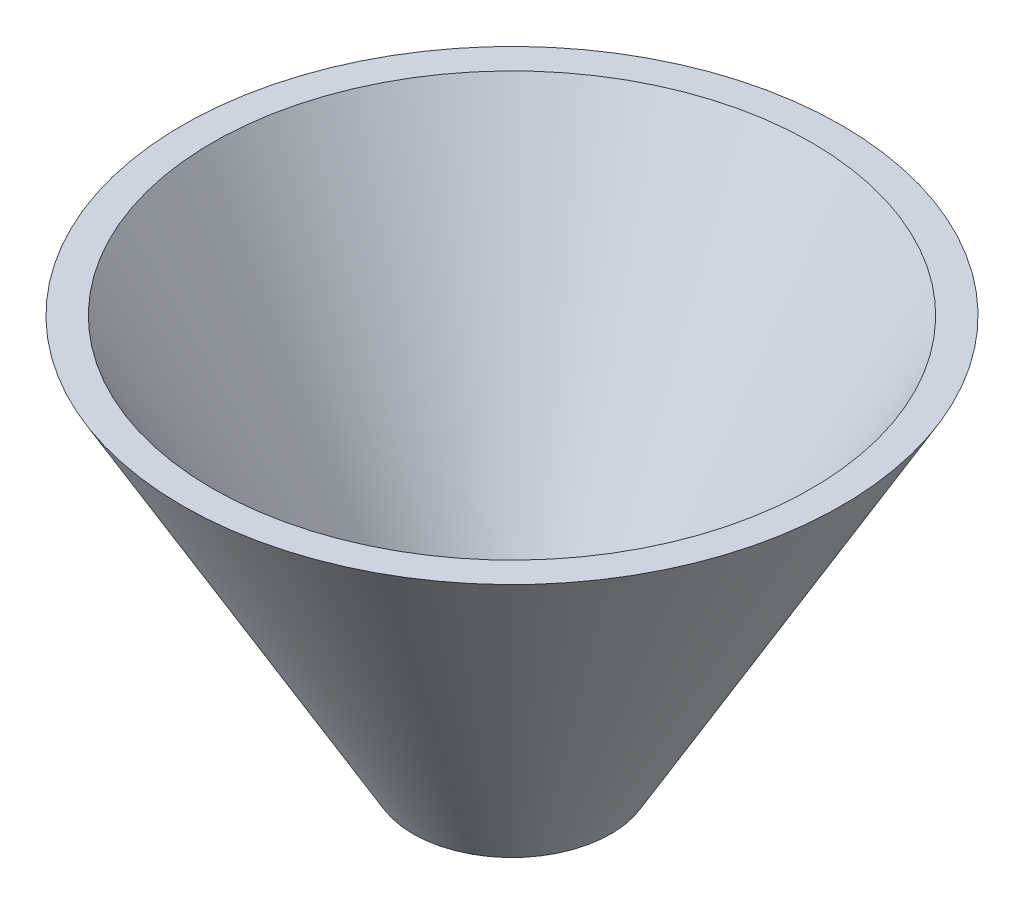
ISO-10303-21;
HEADER;
FILE_DESCRIPTION(('STEP AP214'),'2;1');
FILE_NAME('part.step','',(''),(''),'','','');
FILE_SCHEMA(('AUTOMOTIVE_DESIGN { 1 0 10303 214 1 1 1 1 }'));
ENDSEC;
DATA;
#1=APPLICATION_CONTEXT('core data for automotive mechanical design processes');
#2=APPLICATION_PROTOCOL_DEFINITION('international standard','automotive_design',2000,#1);
#3=PRODUCT_CONTEXT('',#1,'mechanical');
#4=PRODUCT('Part','Part','',(#3));
#5=PRODUCT_RELATED_PRODUCT_CATEGORY('part','',(#4));
#6=PRODUCT_DEFINITION_FORMATION('','',#4);
#7=PRODUCT_DEFINITION_CONTEXT('part definition',#1,'design');
#8=PRODUCT_DEFINITION('design','',#6,#7);
#9=PRODUCT_DEFINITION_SHAPE('','',#8);
#10=(LENGTH_UNIT() NAMED_UNIT(*) SI_UNIT(.MILLI.,.METRE.));
#11=(NAMED_UNIT(*) PLANE_ANGLE_UNIT() SI_UNIT($,.RADIAN.));
#12=(NAMED_UNIT(*) SI_UNIT($,.STERADIAN.) SOLID_ANGLE_UNIT());
#13=UNCERTAINTY_MEASURE_WITH_UNIT(LENGTH_MEASURE(1.E-05),#10,'distance_accuracy_value','');
#14=(GEOMETRIC_REPRESENTATION_CONTEXT(3) GLOBAL_UNCERTAINTY_ASSIGNED_CONTEXT((#13)) GLOBAL_UNIT_ASSIGNED_CONTEXT((#10,
#11,#12)) REPRESENTATION_CONTEXT('',''));
#15=CARTESIAN_POINT('',(0.,0.,0.));
#16=DIRECTION('',(0.,0.,1.));
#17=DIRECTION('',(1.,0.,0.));
#18=AXIS2_PLACEMENT_3D('',#15,#16,#17);
#19=CARTESIAN_POINT('',(0.,0.,0.));
#20=DIRECTION('',(0.,-1.,0.));
#21=DIRECTION('',(0.,0.,-1.));
#22=AXIS2_PLACEMENT_3D('',#19,#20,#21);
#23=PLANE('',#22);
#24=CARTESIAN_POINT('',(0.,0.,0.));
#25=DIRECTION('',(0.,-1.,0.));
#26=DIRECTION('',(0.,0.,-1.));
#27=AXIS2_PLACEMENT_3D('',#24,#25,#26);
#28=CIRCLE('',#27,3.45);
#29=CARTESIAN_POINT('',(0.,0.,3.45));
#30=VERTEX_POINT('',#29);
#31=EDGE_CURVE('E45',#30,#30,#28,.T.);
#32=ORIENTED_EDGE('',*,*,#31,.F.);
#33=EDGE_LOOP('',(#32));
#34=FACE_BOUND('',#33,.T.);
#35=CARTESIAN_POINT('',(0.,0.,0.));
#36=DIRECTION('',(0.,-1.,0.));
#37=DIRECTION('',(0.,0.,-1.));
#38=AXIS2_PLACEMENT_3D('',#35,#36,#37);
#39=CIRCLE('',#38,4.95);
#40=CARTESIAN_POINT('',(0.,0.,4.95));
#41=VERTEX_POINT('',#40);
#42=EDGE_CURVE('E10',#41,#41,#39,.T.);
#43=ORIENTED_EDGE('',*,*,#42,.T.);
#44=EDGE_LOOP('',(#43));
#45=FACE_BOUND('',#44,.T.);
#46=ADVANCED_FACE('F35',(#34,#45),#23,.T.);
#47=CARTESIAN_POINT('',(0.,0.,0.));
#48=DIRECTION('',(0.,1.,0.));
#49=DIRECTION('',(0.,0.,1.));
#50=AXIS2_PLACEMENT_3D('',#47,#48,#49);
#51=CONICAL_SURFACE('',#50,4.95,0.523598775598296);
#52=CARTESIAN_POINT('',(0.,20.,0.));
#53=DIRECTION('',(0.,-1.,0.));
#54=DIRECTION('',(0.,0.,-1.));
#55=AXIS2_PLACEMENT_3D('',#52,#53,#54);
#56=CIRCLE('',#55,16.4970053837924);
#57=CARTESIAN_POINT('',(0.,20.,16.4970053837924));
#58=VERTEX_POINT('',#57);
#59=EDGE_CURVE('E41',#58,#58,#56,.T.);
#60=CARTESIAN_POINT('',(0.,20.,16.4970053837924));
#61=CARTESIAN_POINT('',(0.,19.7916666666667,16.3767240777113));
#62=CARTESIAN_POINT('',(0.,19.5833333333333,16.2564427716301));
#63=CARTESIAN_POINT('',(0.,19.1666666666667,16.0158801594678));
#64=CARTESIAN_POINT('',(0.,18.9583333333333,15.8955988533866));
#65=CARTESIAN_POINT('',(0.,18.5416666666667,15.6550362412242));
#66=CARTESIAN_POINT('',(0.,18.3333333333333,15.5347549351431));
#67=CARTESIAN_POINT('',(0.,17.9166666666667,15.2941923229807));
#68=CARTESIAN_POINT('',(0.,17.7083333333333,15.1739110168996));
#69=CARTESIAN_POINT('',(0.,17.2916666666667,14.9333484047372));
#70=CARTESIAN_POINT('',(0.,17.0833333333333,14.813067098656));
#71=CARTESIAN_POINT('',(0.,16.6666666666667,14.5725044864937));
#72=CARTESIAN_POINT('',(0.,16.4583333333333,14.4522231804125));
#73=CARTESIAN_POINT('',(0.,16.0416666666667,14.2116605682502));
#74=CARTESIAN_POINT('',(0.,15.8333333333333,14.091379262169));
#75=CARTESIAN_POINT('',(0.,15.4166666666667,13.8508166500067));
#76=CARTESIAN_POINT('',(0.,15.2083333333333,13.7305353439255));
#77=CARTESIAN_POINT('',(0.,14.7916666666667,13.4899727317632));
#78=CARTESIAN_POINT('',(0.,14.5833333333333,13.369691425682));
#79=CARTESIAN_POINT('',(0.,14.1666666666667,13.1291288135196));
#80=CARTESIAN_POINT('',(0.,13.9583333333333,13.0088475074385));
#81=CARTESIAN_POINT('',(0.,13.5416666666667,12.7682848952761));
#82=CARTESIAN_POINT('',(0.,13.3333333333333,12.648003589195));
#83=CARTESIAN_POINT('',(0.,12.9166666666667,12.4074409770326));
#84=CARTESIAN_POINT('',(0.,12.7083333333333,12.2871596709514));
#85=CARTESIAN_POINT('',(0.,12.2916666666667,12.0465970587891));
#86=CARTESIAN_POINT('',(0.,12.0833333333333,11.9263157527079));
#87=CARTESIAN_POINT('',(0.,11.6666666666667,11.6857531405456));
#88=CARTESIAN_POINT('',(0.,11.4583333333333,11.5654718344644));
#89=CARTESIAN_POINT('',(0.,11.0416666666667,11.3249092223021));
#90=CARTESIAN_POINT('',(0.,10.8333333333333,11.2046279162209));
#91=CARTESIAN_POINT('',(0.,10.4166666666667,10.9640653040586));
#92=CARTESIAN_POINT('',(0.,10.2083333333333,10.8437839979774));
#93=CARTESIAN_POINT('',(0.,9.79166666666667,10.6032213858151));
#94=CARTESIAN_POINT('',(0.,9.58333333333333,10.4829400797339));
#95=CARTESIAN_POINT('',(0.,9.16666666666667,10.2423774675715));
#96=CARTESIAN_POINT('',(0.,8.95833333333333,10.1220961614904));
#97=CARTESIAN_POINT('',(0.,8.54166666666667,9.88153354932802));
#98=CARTESIAN_POINT('',(0.,8.33333333333334,9.76125224324685));
#99=CARTESIAN_POINT('',(0.,7.91666666666667,9.52068963108451));
#100=CARTESIAN_POINT('',(0.,7.70833333333334,9.40040832500334));
#101=CARTESIAN_POINT('',(0.,7.29166666666667,9.159845712841));
#102=CARTESIAN_POINT('',(0.,7.08333333333333,9.03956440675982));
#103=CARTESIAN_POINT('',(0.,6.66666666666667,8.79900179459748));
#104=CARTESIAN_POINT('',(0.,6.45833333333333,8.67872048851631));
#105=CARTESIAN_POINT('',(0.,6.04166666666667,8.43815787635397));
#106=CARTESIAN_POINT('',(0.,5.83333333333334,8.3178765702728));
#107=CARTESIAN_POINT('',(0.,5.41666666666667,8.07731395811046));
#108=CARTESIAN_POINT('',(0.,5.20833333333333,7.95703265202928));
#109=CARTESIAN_POINT('',(0.,4.79166666666667,7.71647003986694));
#110=CARTESIAN_POINT('',(0.,4.58333333333333,7.59618873378577));
#111=CARTESIAN_POINT('',(0.,4.16666666666667,7.35562612162343));
#112=CARTESIAN_POINT('',(0.,3.95833333333333,7.23534481554225));
#113=CARTESIAN_POINT('',(0.,3.54166666666667,6.99478220337991));
#114=CARTESIAN_POINT('',(0.,3.33333333333333,6.87450089729874));
#115=CARTESIAN_POINT('',(0.,2.91666666666667,6.6339382851364));
#116=CARTESIAN_POINT('',(0.,2.70833333333333,6.51365697905523));
#117=CARTESIAN_POINT('',(0.,2.29166666666667,6.27309436689288));
#118=CARTESIAN_POINT('',(0.,2.08333333333334,6.15281306081171));
#119=CARTESIAN_POINT('',(0.,1.66666666666667,5.91225044864937));
#120=CARTESIAN_POINT('',(0.,1.45833333333333,5.7919691425682));
#121=CARTESIAN_POINT('',(0.,1.04166666666667,5.55140653040586));
#122=CARTESIAN_POINT('',(0.,0.833333333333334,5.43112522432469));
#123=CARTESIAN_POINT('',(0.,0.416666666666667,5.19056261216234));
#124=CARTESIAN_POINT('',(0.,0.208333333333334,5.07028130608117));
#125=CARTESIAN_POINT('',(0.,0.,4.95));
#126=B_SPLINE_CURVE_WITH_KNOTS('',3,(#60,#61,#62,#63,#64,#65,#66,#67,#68,#69,#70,#71,#72,#73,
#74,#75,#76,#77,#78,#79,#80,#81,#82,#83,#84,#85,#86,#87,#88,#89,#90,#91,#92,#93,#94,#95,#96,#97,
#98,#99,#100,#101,#102,#103,#104,#105,#106,#107,#108,#109,#110,#111,#112,#113,#114,#115,#116,
#117,#118,#119,#120,#121,#122,#123,#124,#125),.UNSPECIFIED.,.F.,.F.,(4,2,2,2,2,2,2,2,2,2,2,2,2,
2,2,2,2,2,2,2,2,2,2,2,2,2,2,2,2,2,2,2,4),(0.,0.721687836487032,1.44337567297406,2.1650635094611,
2.88675134594813,3.60843918243515,4.33012701892219,5.05181485540922,5.77350269189625,
6.49519052838328,7.21687836487031,7.93856620135734,8.66025403784438,9.38194187433141,
10.1036297108184,10.8253175473055,11.5470053837925,12.2686932202795,12.9903810567666,
13.7120688932536,14.4337567297406,15.1554445662277,15.8771324027147,16.5988202392017,
17.3205080756887,18.0421959121758,18.7638837486628,19.4855715851498,20.2072594216369,
20.9289472581239,21.6506350946109,22.372322931098,23.094010767585),.UNSPECIFIED.);
#127=EDGE_CURVE('BSEAM65',#58,#41,#126,.T.);
#128=ORIENTED_EDGE('',*,*,#59,.T.);
#129=ORIENTED_EDGE('',*,*,#42,.F.);
#130=ORIENTED_EDGE('',*,*,#127,.T.);
#131=ORIENTED_EDGE('',*,*,#127,.F.);
#132=EDGE_LOOP('',(#128,#130,#129,#131));
#133=FACE_BOUND('',#132,.T.);
#134=ADVANCED_FACE('F65',(#133),#51,.T.);
#135=CARTESIAN_POINT('',(16.4970053837924,20.,0.));
#136=DIRECTION('',(0.,1.,0.));
#137=DIRECTION('',(0.,0.,1.));
#138=AXIS2_PLACEMENT_3D('',#135,#136,#137);
#139=PLANE('',#138);
#140=CARTESIAN_POINT('',(0.,20.,0.));
#141=DIRECTION('',(0.,-1.,0.));
#142=DIRECTION('',(0.,0.,-1.));
#143=AXIS2_PLACEMENT_3D('',#140,#141,#142);
#144=CIRCLE('',#143,14.9970053837924);
#145=CARTESIAN_POINT('',(0.,20.,14.9970053837924));
#146=VERTEX_POINT('',#145);
#147=EDGE_CURVE('E49',#146,#146,#144,.T.);
#148=ORIENTED_EDGE('',*,*,#147,.T.);
#149=EDGE_LOOP('',(#148));
#150=FACE_BOUND('',#149,.T.);
#151=ORIENTED_EDGE('',*,*,#59,.F.);
#152=EDGE_LOOP('',(#151));
#153=FACE_BOUND('',#152,.T.);
#154=ADVANCED_FACE('F55',(#150,#153),#139,.T.);
#155=CARTESIAN_POINT('',(0.,0.,0.));
#156=DIRECTION('',(0.,1.,0.));
#157=DIRECTION('',(0.,0.,1.));
#158=AXIS2_PLACEMENT_3D('',#155,#156,#157);
#159=CONICAL_SURFACE('',#158,3.45,0.523598775598296);
#160=CARTESIAN_POINT('',(0.,20.,14.9970053837924));
#161=CARTESIAN_POINT('',(0.,19.7916666666667,14.8767240777113));
#162=CARTESIAN_POINT('',(0.,19.5833333333333,14.7564427716301));
#163=CARTESIAN_POINT('',(0.,19.1666666666667,14.5158801594678));
#164=CARTESIAN_POINT('',(0.,18.9583333333333,14.3955988533866));
#165=CARTESIAN_POINT('',(0.,18.5416666666667,14.1550362412242));
#166=CARTESIAN_POINT('',(0.,18.3333333333333,14.0347549351431));
#167=CARTESIAN_POINT('',(0.,17.9166666666667,13.7941923229807));
#168=CARTESIAN_POINT('',(0.,17.7083333333333,13.6739110168996));
#169=CARTESIAN_POINT('',(0.,17.2916666666667,13.4333484047372));
#170=CARTESIAN_POINT('',(0.,17.0833333333333,13.3130670986561));
#171=CARTESIAN_POINT('',(0.,16.6666666666667,13.0725044864937));
#172=CARTESIAN_POINT('',(0.,16.4583333333333,12.9522231804125));
#173=CARTESIAN_POINT('',(0.,16.0416666666667,12.7116605682502));
#174=CARTESIAN_POINT('',(0.,15.8333333333333,12.591379262169));
#175=CARTESIAN_POINT('',(0.,15.4166666666667,12.3508166500067));
#176=CARTESIAN_POINT('',(0.,15.2083333333333,12.2305353439255));
#177=CARTESIAN_POINT('',(0.,14.7916666666667,11.9899727317632));
#178=CARTESIAN_POINT('',(0.,14.5833333333333,11.869691425682));
#179=CARTESIAN_POINT('',(0.,14.1666666666667,11.6291288135196));
#180=CARTESIAN_POINT('',(0.,13.9583333333333,11.5088475074385));
#181=CARTESIAN_POINT('',(0.,13.5416666666667,11.2682848952761));
#182=CARTESIAN_POINT('',(0.,13.3333333333333,11.148003589195));
#183=CARTESIAN_POINT('',(0.,12.9166666666667,10.9074409770326));
#184=CARTESIAN_POINT('',(0.,12.7083333333333,10.7871596709515));
#185=CARTESIAN_POINT('',(0.,12.2916666666667,10.5465970587891));
#186=CARTESIAN_POINT('',(0.,12.0833333333333,10.4263157527079));
#187=CARTESIAN_POINT('',(0.,11.6666666666667,10.1857531405456));
#188=CARTESIAN_POINT('',(0.,11.4583333333333,10.0654718344644));
#189=CARTESIAN_POINT('',(0.,11.0416666666667,9.82490922230208));
#190=CARTESIAN_POINT('',(0.,10.8333333333333,9.70462791622091));
#191=CARTESIAN_POINT('',(0.,10.4166666666667,9.46406530405856));
#192=CARTESIAN_POINT('',(0.,10.2083333333333,9.3437839979774));
#193=CARTESIAN_POINT('',(0.,9.79166666666667,9.10322138581505));
#194=CARTESIAN_POINT('',(0.,9.58333333333333,8.98294007973388));
#195=CARTESIAN_POINT('',(0.,9.16666666666667,8.74237746757154));
#196=CARTESIAN_POINT('',(0.,8.95833333333333,8.62209616149037));
#197=CARTESIAN_POINT('',(0.,8.54166666666667,8.38153354932803));
#198=CARTESIAN_POINT('',(0.,8.33333333333334,8.26125224324685));
#199=CARTESIAN_POINT('',(0.,7.91666666666667,8.02068963108451));
#200=CARTESIAN_POINT('',(0.,7.70833333333333,7.90040832500334));
#201=CARTESIAN_POINT('',(0.,7.29166666666667,7.659845712841));
#202=CARTESIAN_POINT('',(0.,7.08333333333333,7.53956440675983));
#203=CARTESIAN_POINT('',(0.,6.66666666666667,7.29900179459748));
#204=CARTESIAN_POINT('',(0.,6.45833333333333,7.17872048851631));
#205=CARTESIAN_POINT('',(0.,6.04166666666667,6.93815787635397));
#206=CARTESIAN_POINT('',(0.,5.83333333333334,6.8178765702728));
#207=CARTESIAN_POINT('',(0.,5.41666666666667,6.57731395811046));
#208=CARTESIAN_POINT('',(0.,5.20833333333333,6.45703265202928));
#209=CARTESIAN_POINT('',(0.,4.79166666666667,6.21647003986694));
#210=CARTESIAN_POINT('',(0.,4.58333333333333,6.09618873378577));
#211=CARTESIAN_POINT('',(0.,4.16666666666667,5.85562612162343));
#212=CARTESIAN_POINT('',(0.,3.95833333333333,5.73534481554226));
#213=CARTESIAN_POINT('',(0.,3.54166666666667,5.49478220337991));
#214=CARTESIAN_POINT('',(0.,3.33333333333333,5.37450089729874));
#215=CARTESIAN_POINT('',(0.,2.91666666666667,5.1339382851364));
#216=CARTESIAN_POINT('',(0.,2.70833333333333,5.01365697905523));
#217=CARTESIAN_POINT('',(0.,2.29166666666667,4.77309436689289));
#218=CARTESIAN_POINT('',(0.,2.08333333333334,4.65281306081171));
#219=CARTESIAN_POINT('',(0.,1.66666666666667,4.41225044864937));
#220=CARTESIAN_POINT('',(0.,1.45833333333333,4.2919691425682));
#221=CARTESIAN_POINT('',(0.,1.04166666666667,4.05140653040586));
#222=CARTESIAN_POINT('',(0.,0.833333333333334,3.93112522432469));
#223=CARTESIAN_POINT('',(0.,0.416666666666667,3.69056261216234));
#224=CARTESIAN_POINT('',(0.,0.208333333333333,3.57028130608117));
#225=CARTESIAN_POINT('',(0.,0.,3.45));
#226=B_SPLINE_CURVE_WITH_KNOTS('',3,(#160,#161,#162,#163,#164,#165,#166,#167,#168,#169,#170,
#171,#172,#173,#174,#175,#176,#177,#178,#179,#180,#181,#182,#183,#184,#185,#186,#187,#188,#189,
#190,#191,#192,#193,#194,#195,#196,#197,#198,#199,#200,#201,#202,#203,#204,#205,#206,#207,#208,
#209,#210,#211,#212,#213,#214,#215,#216,#217,#218,#219,#220,#221,#222,#223,#224,#225),
.UNSPECIFIED.,.F.,.F.,(4,2,2,2,2,2,2,2,2,2,2,2,2,2,2,2,2,2,2,2,2,2,2,2,2,2,2,2,2,2,2,2,4),(0.,
0.721687836487032,1.44337567297406,2.1650635094611,2.88675134594813,3.60843918243515,
4.33012701892219,5.05181485540922,5.77350269189625,6.49519052838328,7.21687836487031,
7.93856620135734,8.66025403784437,9.38194187433141,10.1036297108184,10.8253175473055,
11.5470053837925,12.2686932202795,12.9903810567666,13.7120688932536,14.4337567297406,
15.1554445662277,15.8771324027147,16.5988202392017,17.3205080756887,18.0421959121758,
18.7638837486628,19.4855715851498,20.2072594216369,20.9289472581239,21.6506350946109,
22.372322931098,23.094010767585),.UNSPECIFIED.);
#227=EDGE_CURVE('BSEAM58',#146,#30,#226,.T.);
#228=ORIENTED_EDGE('',*,*,#147,.F.);
#229=ORIENTED_EDGE('',*,*,#31,.T.);
#230=ORIENTED_EDGE('',*,*,#227,.T.);
#231=ORIENTED_EDGE('',*,*,#227,.F.);
#232=EDGE_LOOP('',(#228,#230,#229,#231));
#233=FACE_BOUND('',#232,.T.);
#234=ADVANCED_FACE('F58',(#233),#159,.F.);
#235=CLOSED_SHELL('',(#46,#134,#154,#234));
#236=MANIFOLD_SOLID_BREP('B2',#235);
#237=ADVANCED_BREP_SHAPE_REPRESENTATION('',(#18,#236),#14);
#238=SHAPE_DEFINITION_REPRESENTATION(#9,#237);
ENDSEC;
END-ISO-10303-21;
